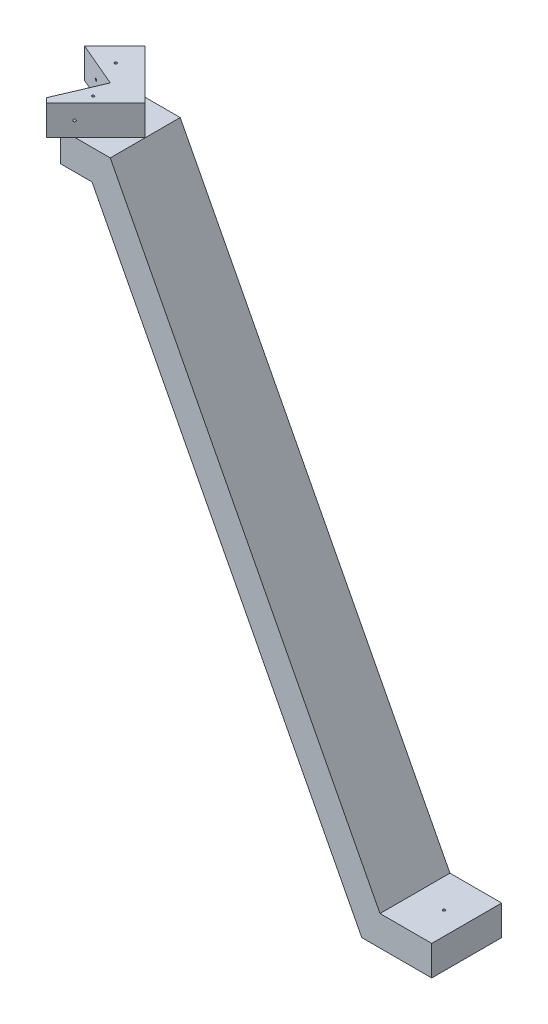
ISO-10303-21;
HEADER;
FILE_DESCRIPTION(('STEP AP214'),'2;1');
FILE_NAME('part.step','',(''),(''),'','','');
FILE_SCHEMA(('AUTOMOTIVE_DESIGN { 1 0 10303 214 1 1 1 1 }'));
ENDSEC;
DATA;
#1=APPLICATION_CONTEXT('core data for automotive mechanical design processes');
#2=APPLICATION_PROTOCOL_DEFINITION('international standard','automotive_design',2000,#1);
#3=PRODUCT_CONTEXT('',#1,'mechanical');
#4=PRODUCT('Part','Part','',(#3));
#5=PRODUCT_RELATED_PRODUCT_CATEGORY('part','',(#4));
#6=PRODUCT_DEFINITION_FORMATION('','',#4);
#7=PRODUCT_DEFINITION_CONTEXT('part definition',#1,'design');
#8=PRODUCT_DEFINITION('design','',#6,#7);
#9=PRODUCT_DEFINITION_SHAPE('','',#8);
#10=(LENGTH_UNIT() NAMED_UNIT(*) SI_UNIT(.MILLI.,.METRE.));
#11=(NAMED_UNIT(*) PLANE_ANGLE_UNIT() SI_UNIT($,.RADIAN.));
#12=(NAMED_UNIT(*) SI_UNIT($,.STERADIAN.) SOLID_ANGLE_UNIT());
#13=UNCERTAINTY_MEASURE_WITH_UNIT(LENGTH_MEASURE(1.E-05),#10,'distance_accuracy_value','');
#14=(GEOMETRIC_REPRESENTATION_CONTEXT(3) GLOBAL_UNCERTAINTY_ASSIGNED_CONTEXT((#13)) GLOBAL_UNIT_ASSIGNED_CONTEXT((#10,
#11,#12)) REPRESENTATION_CONTEXT('',''));
#15=CARTESIAN_POINT('',(0.,0.,0.));
#16=DIRECTION('',(0.,0.,1.));
#17=DIRECTION('',(1.,0.,0.));
#18=AXIS2_PLACEMENT_3D('',#15,#16,#17);
#19=CARTESIAN_POINT('',(-319.752925071649,698.5,44.45));
#20=DIRECTION('',(0.,-1.,0.));
#21=DIRECTION('',(0.,0.,-1.));
#22=AXIS2_PLACEMENT_3D('',#19,#20,#21);
#23=PLANE('',#22);
#24=DIRECTION('',(-0.707106781186549,0.,0.707106781186546));
#25=VECTOR('',#24,1.);
#26=CARTESIAN_POINT('',(-445.476510766618,698.5,0.));
#27=LINE('',#26,#25);
#28=CARTESIAN_POINT('',(-401.026510766617,698.5,-44.45));
#29=VERTEX_POINT('',#28);
#30=CARTESIAN_POINT('',(-408.652925071649,698.5,-36.8235856949683));
#31=VERTEX_POINT('',#30);
#32=EDGE_CURVE('E54',#29,#31,#27,.T.);
#33=ORIENTED_EDGE('',*,*,#32,.F.);
#34=DIRECTION('',(-1.,0.,0.));
#35=VECTOR('',#34,1.);
#36=CARTESIAN_POINT('',(-319.752925071649,698.5,-44.45));
#37=LINE('',#36,#35);
#38=CARTESIAN_POINT('',(-408.652925071649,698.5,-44.45));
#39=VERTEX_POINT('',#38);
#40=EDGE_CURVE('E286',#29,#39,#37,.T.);
#41=ORIENTED_EDGE('',*,*,#40,.T.);
#42=DIRECTION('',(0.,0.,-1.));
#43=VECTOR('',#42,1.);
#44=CARTESIAN_POINT('',(-408.652925071649,698.5,44.45));
#45=LINE('',#44,#43);
#46=EDGE_CURVE('E310',#31,#39,#45,.T.);
#47=ORIENTED_EDGE('',*,*,#46,.F.);
#48=EDGE_LOOP('',(#33,#41,#47));
#49=FACE_BOUND('',#48,.T.);
#50=ADVANCED_FACE('F39',(#49),#23,.F.);
#51=DIRECTION('',(-0.707106781186549,0.,-0.707106781186546));
#52=VECTOR('',#51,1.);
#53=CARTESIAN_POINT('',(-382.614717919133,698.5,-62.8617928474839));
#54=LINE('',#53,#52);
#55=CARTESIAN_POINT('',(-319.752925071649,698.5,0.));
#56=VERTEX_POINT('',#55);
#57=CARTESIAN_POINT('',(-364.202925071649,698.5,-44.45));
#58=VERTEX_POINT('',#57);
#59=EDGE_CURVE('E70',#56,#58,#54,.T.);
#60=ORIENTED_EDGE('',*,*,#59,.F.);
#61=DIRECTION('',(0.,0.,-1.));
#62=VECTOR('',#61,1.);
#63=CARTESIAN_POINT('',(-319.752925071649,698.5,44.45));
#64=LINE('',#63,#62);
#65=CARTESIAN_POINT('',(-319.752925071649,698.5,-44.45));
#66=VERTEX_POINT('',#65);
#67=EDGE_CURVE('E314',#56,#66,#64,.T.);
#68=ORIENTED_EDGE('',*,*,#67,.T.);
#69=EDGE_CURVE('E287',#66,#58,#37,.T.);
#70=ORIENTED_EDGE('',*,*,#69,.T.);
#71=EDGE_LOOP('',(#60,#68,#70));
#72=FACE_BOUND('',#71,.T.);
#73=ADVANCED_FACE('F433',(#72),#23,.F.);
#74=DIRECTION('',(0.707106781186549,0.,-0.707106781186546));
#75=VECTOR('',#74,1.);
#76=CARTESIAN_POINT('',(-319.752925071649,698.5,0.));
#77=LINE('',#76,#75);
#78=CARTESIAN_POINT('',(-364.202925071649,698.5,44.45));
#79=VERTEX_POINT('',#78);
#80=EDGE_CURVE('E225',#79,#56,#77,.T.);
#81=ORIENTED_EDGE('',*,*,#80,.F.);
#82=DIRECTION('',(-1.,0.,0.));
#83=VECTOR('',#82,1.);
#84=CARTESIAN_POINT('',(-319.752925071649,698.5,44.45));
#85=LINE('',#84,#83);
#86=CARTESIAN_POINT('',(-319.752925071649,698.5,44.45));
#87=VERTEX_POINT('',#86);
#88=EDGE_CURVE('E263',#87,#79,#85,.T.);
#89=ORIENTED_EDGE('',*,*,#88,.F.);
#90=EDGE_CURVE('E315',#87,#56,#64,.T.);
#91=ORIENTED_EDGE('',*,*,#90,.T.);
#92=EDGE_LOOP('',(#81,#89,#91));
#93=FACE_BOUND('',#92,.T.);
#94=ADVANCED_FACE('F452',(#93),#23,.F.);
#95=CARTESIAN_POINT('',(88.9,0.,44.45));
#96=DIRECTION('',(0.,1.,0.));
#97=DIRECTION('',(0.,0.,1.));
#98=AXIS2_PLACEMENT_3D('',#95,#96,#97);
#99=PLANE('',#98);
#100=CARTESIAN_POINT('',(60.1472,0.,0.));
#101=DIRECTION('',(0.,1.,0.));
#102=DIRECTION('',(0.,0.,1.));
#103=AXIS2_PLACEMENT_3D('',#100,#101,#102);
#104=CIRCLE('',#103,1.58749999999999);
#105=CARTESIAN_POINT('',(60.1472,0.,1.58749999999999));
#106=VERTEX_POINT('',#105);
#107=EDGE_CURVE('E243',#106,#106,#104,.T.);
#108=ORIENTED_EDGE('',*,*,#107,.T.);
#109=EDGE_LOOP('',(#108));
#110=FACE_BOUND('',#109,.T.);
#111=DIRECTION('',(1.,0.,0.));
#112=VECTOR('',#111,1.);
#113=CARTESIAN_POINT('',(88.9,0.,-44.45));
#114=LINE('',#113,#112);
#115=CARTESIAN_POINT('',(0.,0.,-44.45));
#116=VERTEX_POINT('',#115);
#117=CARTESIAN_POINT('',(88.9,0.,-44.45));
#118=VERTEX_POINT('',#117);
#119=EDGE_CURVE('E247',#116,#118,#114,.T.);
#120=ORIENTED_EDGE('',*,*,#119,.T.);
#121=DIRECTION('',(0.,0.,-1.));
#122=VECTOR('',#121,1.);
#123=CARTESIAN_POINT('',(88.9,0.,44.45));
#124=LINE('',#123,#122);
#125=CARTESIAN_POINT('',(88.9,0.,44.45));
#126=VERTEX_POINT('',#125);
#127=EDGE_CURVE('E327',#126,#118,#124,.T.);
#128=ORIENTED_EDGE('',*,*,#127,.F.);
#129=DIRECTION('',(1.,0.,0.));
#130=VECTOR('',#129,1.);
#131=CARTESIAN_POINT('',(88.9,0.,44.45));
#132=LINE('',#131,#130);
#133=CARTESIAN_POINT('',(0.,0.,44.45));
#134=VERTEX_POINT('',#133);
#135=EDGE_CURVE('E248',#134,#126,#132,.T.);
#136=ORIENTED_EDGE('',*,*,#135,.F.);
#137=DIRECTION('',(0.,0.,-1.));
#138=VECTOR('',#137,1.);
#139=CARTESIAN_POINT('',(0.,0.,44.45));
#140=LINE('',#139,#138);
#141=EDGE_CURVE('E272',#134,#116,#140,.T.);
#142=ORIENTED_EDGE('',*,*,#141,.T.);
#143=EDGE_LOOP('',(#120,#128,#136,#142));
#144=FACE_BOUND('',#143,.T.);
#145=ADVANCED_FACE('F41',(#110,#144),#99,.F.);
#146=CARTESIAN_POINT('',(88.9,38.1,44.45));
#147=DIRECTION('',(-1.,0.,0.));
#148=DIRECTION('',(0.,0.,1.));
#149=AXIS2_PLACEMENT_3D('',#146,#147,#148);
#150=PLANE('',#149);
#151=DIRECTION('',(0.,1.,0.));
#152=VECTOR('',#151,1.);
#153=CARTESIAN_POINT('',(88.9,38.1,-44.45));
#154=LINE('',#153,#152);
#155=CARTESIAN_POINT('',(88.9,38.1,-44.45));
#156=VERTEX_POINT('',#155);
#157=EDGE_CURVE('E276',#118,#156,#154,.T.);
#158=ORIENTED_EDGE('',*,*,#157,.T.);
#159=DIRECTION('',(0.,0.,-1.));
#160=VECTOR('',#159,1.);
#161=CARTESIAN_POINT('',(88.9,38.1,44.45));
#162=LINE('',#161,#160);
#163=CARTESIAN_POINT('',(88.9,38.1,44.45));
#164=VERTEX_POINT('',#163);
#165=EDGE_CURVE('E323',#164,#156,#162,.T.);
#166=ORIENTED_EDGE('',*,*,#165,.F.);
#167=DIRECTION('',(0.,1.,0.));
#168=VECTOR('',#167,1.);
#169=CARTESIAN_POINT('',(88.9,38.1,44.45));
#170=LINE('',#169,#168);
#171=EDGE_CURVE('E252',#126,#164,#170,.T.);
#172=ORIENTED_EDGE('',*,*,#171,.F.);
#173=ORIENTED_EDGE('',*,*,#127,.T.);
#174=EDGE_LOOP('',(#158,#166,#172,#173));
#175=FACE_BOUND('',#174,.T.);
#176=ADVANCED_FACE('F444',(#175),#150,.F.);
#177=CARTESIAN_POINT('',(23.1470749283508,38.1,44.45));
#178=DIRECTION('',(0.,-1.,0.));
#179=DIRECTION('',(0.,0.,-1.));
#180=AXIS2_PLACEMENT_3D('',#177,#178,#179);
#181=PLANE('',#180);
#182=CARTESIAN_POINT('',(60.1472,38.1,0.));
#183=DIRECTION('',(0.,1.,0.));
#184=DIRECTION('',(0.,0.,1.));
#185=AXIS2_PLACEMENT_3D('',#182,#183,#184);
#186=CIRCLE('',#185,1.58749999999999);
#187=CARTESIAN_POINT('',(60.1472,38.1,1.58749999999999));
#188=VERTEX_POINT('',#187);
#189=EDGE_CURVE('E239',#188,#188,#186,.T.);
#190=ORIENTED_EDGE('',*,*,#189,.F.);
#191=EDGE_LOOP('',(#190));
#192=FACE_BOUND('',#191,.T.);
#193=DIRECTION('',(-1.,0.,0.));
#194=VECTOR('',#193,1.);
#195=CARTESIAN_POINT('',(23.1470749283508,38.1,-44.45));
#196=LINE('',#195,#194);
#197=CARTESIAN_POINT('',(23.1470749283508,38.1,-44.45));
#198=VERTEX_POINT('',#197);
#199=EDGE_CURVE('E279',#156,#198,#196,.T.);
#200=ORIENTED_EDGE('',*,*,#199,.T.);
#201=DIRECTION('',(0.,0.,-1.));
#202=VECTOR('',#201,1.);
#203=CARTESIAN_POINT('',(23.1470749283508,38.1,44.45));
#204=LINE('',#203,#202);
#205=CARTESIAN_POINT('',(23.1470749283508,38.1,44.45));
#206=VERTEX_POINT('',#205);
#207=EDGE_CURVE('E319',#206,#198,#204,.T.);
#208=ORIENTED_EDGE('',*,*,#207,.F.);
#209=DIRECTION('',(-1.,0.,0.));
#210=VECTOR('',#209,1.);
#211=CARTESIAN_POINT('',(23.1470749283508,38.1,44.45));
#212=LINE('',#211,#210);
#213=EDGE_CURVE('E256',#164,#206,#212,.T.);
#214=ORIENTED_EDGE('',*,*,#213,.F.);
#215=ORIENTED_EDGE('',*,*,#165,.T.);
#216=EDGE_LOOP('',(#200,#208,#214,#215));
#217=FACE_BOUND('',#216,.T.);
#218=ADVANCED_FACE('F441',(#192,#217),#181,.F.);
#219=CARTESIAN_POINT('',(-319.752925071649,698.5,44.45));
#220=DIRECTION('',(-0.88749607680174,-0.460815270647057,0.));
#221=DIRECTION('',(0.460815270647057,-0.88749607680174,0.));
#222=AXIS2_PLACEMENT_3D('',#219,#220,#221);
#223=PLANE('',#222);
#224=DIRECTION('',(-0.460815270647057,0.88749607680174,0.));
#225=VECTOR('',#224,1.);
#226=CARTESIAN_POINT('',(-319.752925071649,698.5,-44.45));
#227=LINE('',#226,#225);
#228=EDGE_CURVE('E282',#198,#66,#227,.T.);
#229=ORIENTED_EDGE('',*,*,#228,.T.);
#230=ORIENTED_EDGE('',*,*,#67,.F.);
#231=ORIENTED_EDGE('',*,*,#90,.F.);
#232=DIRECTION('',(-0.460815270647057,0.88749607680174,0.));
#233=VECTOR('',#232,1.);
#234=CARTESIAN_POINT('',(-319.752925071649,698.5,44.45));
#235=LINE('',#234,#233);
#236=EDGE_CURVE('E259',#206,#87,#235,.T.);
#237=ORIENTED_EDGE('',*,*,#236,.F.);
#238=ORIENTED_EDGE('',*,*,#207,.T.);
#239=EDGE_LOOP('',(#229,#230,#231,#237,#238));
#240=FACE_BOUND('',#239,.T.);
#241=ADVANCED_FACE('F437',(#240),#223,.F.);
#242=CARTESIAN_POINT('',(-408.652925071649,698.5,44.45));
#243=DIRECTION('',(1.,0.,0.));
#244=DIRECTION('',(0.,0.,-1.));
#245=AXIS2_PLACEMENT_3D('',#242,#243,#244);
#246=PLANE('',#245);
#247=DIRECTION('',(0.,0.,-1.));
#248=VECTOR('',#247,1.);
#249=CARTESIAN_POINT('',(-408.652925071649,660.4,44.45));
#250=LINE('',#249,#248);
#251=CARTESIAN_POINT('',(-408.652925071649,660.4,-18.9769560653851));
#252=VERTEX_POINT('',#251);
#253=CARTESIAN_POINT('',(-408.652925071649,660.4,-44.45));
#254=VERTEX_POINT('',#253);
#255=EDGE_CURVE('E307',#252,#254,#250,.T.);
#256=ORIENTED_EDGE('',*,*,#255,.F.);
#257=DIRECTION('',(0.,1.,0.));
#258=VECTOR('',#257,1.);
#259=CARTESIAN_POINT('',(-408.652925071649,698.5,-18.9769560653851));
#260=LINE('',#259,#258);
#261=CARTESIAN_POINT('',(-408.652925071649,698.5,-18.9769560653851));
#262=VERTEX_POINT('',#261);
#263=EDGE_CURVE('E171',#252,#262,#260,.T.);
#264=ORIENTED_EDGE('',*,*,#263,.T.);
#265=EDGE_CURVE('E311',#262,#31,#45,.T.);
#266=ORIENTED_EDGE('',*,*,#265,.T.);
#267=ORIENTED_EDGE('',*,*,#46,.T.);
#268=DIRECTION('',(0.,-1.,0.));
#269=VECTOR('',#268,1.);
#270=CARTESIAN_POINT('',(-408.652925071649,698.5,-44.45));
#271=LINE('',#270,#269);
#272=EDGE_CURVE('E290',#39,#254,#271,.T.);
#273=ORIENTED_EDGE('',*,*,#272,.T.);
#274=EDGE_LOOP('',(#256,#264,#266,#267,#273));
#275=FACE_BOUND('',#274,.T.);
#276=ADVANCED_FACE('F398',(#275),#246,.F.);
#277=CARTESIAN_POINT('',(-408.652925071649,660.4,44.45));
#278=DIRECTION('',(0.,1.,0.));
#279=DIRECTION('',(0.,0.,1.));
#280=AXIS2_PLACEMENT_3D('',#277,#278,#279);
#281=PLANE('',#280);
#282=CARTESIAN_POINT('',(-360.68,660.4,25.4));
#283=DIRECTION('',(0.,-1.,0.));
#284=DIRECTION('',(0.,0.,-1.));
#285=AXIS2_PLACEMENT_3D('',#282,#283,#284);
#286=CIRCLE('',#285,1.58749999999996);
#287=CARTESIAN_POINT('',(-360.68,660.4,23.8125));
#288=VERTEX_POINT('',#287);
#289=EDGE_CURVE('E680',#288,#288,#286,.T.);
#290=ORIENTED_EDGE('',*,*,#289,.F.);
#291=EDGE_LOOP('',(#290));
#292=FACE_BOUND('',#291,.T.);
#293=CARTESIAN_POINT('',(-382.614717919133,660.4,-25.4));
#294=DIRECTION('',(0.,-1.,0.));
#295=DIRECTION('',(0.,0.,-1.));
#296=AXIS2_PLACEMENT_3D('',#293,#294,#295);
#297=CIRCLE('',#296,1.58749999999996);
#298=CARTESIAN_POINT('',(-382.614717919133,660.4,-26.9875));
#299=VERTEX_POINT('',#298);
#300=EDGE_CURVE('E683',#299,#299,#297,.T.);
#301=ORIENTED_EDGE('',*,*,#300,.F.);
#302=EDGE_LOOP('',(#301));
#303=FACE_BOUND('',#302,.T.);
#304=DIRECTION('',(1.,0.,0.));
#305=VECTOR('',#304,1.);
#306=CARTESIAN_POINT('',(-408.652925071649,660.4,44.45));
#307=LINE('',#306,#305);
#308=CARTESIAN_POINT('',(-383.179881137034,660.4,44.45));
#309=VERTEX_POINT('',#308);
#310=CARTESIAN_POINT('',(-342.9,660.4,44.45));
#311=VERTEX_POINT('',#310);
#312=EDGE_CURVE('E187',#309,#311,#307,.T.);
#313=ORIENTED_EDGE('',*,*,#312,.F.);
#314=DIRECTION('',(0.392642119385449,0.,-0.919691342834379));
#315=VECTOR('',#314,1.);
#316=CARTESIAN_POINT('',(-387.107005143668,660.4,53.6485596369314));
#317=LINE('',#316,#315);
#318=CARTESIAN_POINT('',(-364.202925071649,660.4,0.));
#319=VERTEX_POINT('',#318);
#320=EDGE_CURVE('E179',#309,#319,#317,.T.);
#321=ORIENTED_EDGE('',*,*,#320,.T.);
#322=DIRECTION('',(-0.919691342834381,0.,-0.392642119385445));
#323=VECTOR('',#322,1.);
#324=CARTESIAN_POINT('',(-385.74884499963,660.4,-9.19855963693145));
#325=LINE('',#324,#323);
#326=EDGE_CURVE('E167',#319,#252,#325,.T.);
#327=ORIENTED_EDGE('',*,*,#326,.T.);
#328=ORIENTED_EDGE('',*,*,#255,.T.);
#329=DIRECTION('',(1.,0.,0.));
#330=VECTOR('',#329,1.);
#331=CARTESIAN_POINT('',(-408.652925071649,660.4,-44.45));
#332=LINE('',#331,#330);
#333=CARTESIAN_POINT('',(-342.9,660.4,-44.45));
#334=VERTEX_POINT('',#333);
#335=EDGE_CURVE('E295',#254,#334,#332,.T.);
#336=ORIENTED_EDGE('',*,*,#335,.T.);
#337=DIRECTION('',(0.,0.,-1.));
#338=VECTOR('',#337,1.);
#339=CARTESIAN_POINT('',(-342.9,660.4,44.45));
#340=LINE('',#339,#338);
#341=EDGE_CURVE('E303',#311,#334,#340,.T.);
#342=ORIENTED_EDGE('',*,*,#341,.F.);
#343=EDGE_LOOP('',(#313,#321,#327,#328,#336,#342));
#344=FACE_BOUND('',#343,.T.);
#345=ADVANCED_FACE('F185',(#292,#303,#344),#281,.F.);
#346=CARTESIAN_POINT('',(0.,0.,44.45));
#347=DIRECTION('',(0.88749607680174,0.460815270647057,0.));
#348=DIRECTION('',(-0.460815270647057,0.88749607680174,0.));
#349=AXIS2_PLACEMENT_3D('',#346,#347,#348);
#350=PLANE('',#349);
#351=DIRECTION('',(0.460815270647057,-0.88749607680174,0.));
#352=VECTOR('',#351,1.);
#353=CARTESIAN_POINT('',(0.,0.,-44.45));
#354=LINE('',#353,#352);
#355=EDGE_CURVE('E253',#334,#116,#354,.T.);
#356=ORIENTED_EDGE('',*,*,#355,.T.);
#357=ORIENTED_EDGE('',*,*,#141,.F.);
#358=DIRECTION('',(0.460815270647057,-0.88749607680174,0.));
#359=VECTOR('',#358,1.);
#360=CARTESIAN_POINT('',(0.,0.,44.45));
#361=LINE('',#360,#359);
#362=EDGE_CURVE('E269',#311,#134,#361,.T.);
#363=ORIENTED_EDGE('',*,*,#362,.F.);
#364=ORIENTED_EDGE('',*,*,#341,.T.);
#365=EDGE_LOOP('',(#356,#357,#363,#364));
#366=FACE_BOUND('',#365,.T.);
#367=ADVANCED_FACE('F406',(#366),#350,.F.);
#368=CARTESIAN_POINT('',(0.,0.,44.45));
#369=DIRECTION('',(0.,0.,1.));
#370=DIRECTION('',(1.,0.,0.));
#371=AXIS2_PLACEMENT_3D('',#368,#369,#370);
#372=PLANE('',#371);
#373=DIRECTION('',(0.,1.,0.));
#374=VECTOR('',#373,1.);
#375=CARTESIAN_POINT('',(-383.179881137034,0.,44.45));
#376=LINE('',#375,#374);
#377=CARTESIAN_POINT('',(-383.179881137034,698.5,44.45));
#378=VERTEX_POINT('',#377);
#379=EDGE_CURVE('E190',#309,#378,#376,.T.);
#380=ORIENTED_EDGE('',*,*,#379,.F.);
#381=ORIENTED_EDGE('',*,*,#312,.T.);
#382=ORIENTED_EDGE('',*,*,#362,.T.);
#383=ORIENTED_EDGE('',*,*,#135,.T.);
#384=ORIENTED_EDGE('',*,*,#171,.T.);
#385=ORIENTED_EDGE('',*,*,#213,.T.);
#386=ORIENTED_EDGE('',*,*,#236,.T.);
#387=ORIENTED_EDGE('',*,*,#88,.T.);
#388=EDGE_CURVE('E262',#79,#378,#85,.T.);
#389=ORIENTED_EDGE('',*,*,#388,.T.);
#390=EDGE_LOOP('',(#380,#381,#382,#383,#384,#385,#386,#387,#389));
#391=FACE_BOUND('',#390,.T.);
#392=ADVANCED_FACE('F415',(#391),#372,.T.);
#393=CARTESIAN_POINT('',(0.,0.,-44.45));
#394=DIRECTION('',(0.,0.,1.));
#395=DIRECTION('',(1.,0.,0.));
#396=AXIS2_PLACEMENT_3D('',#393,#394,#395);
#397=PLANE('',#396);
#398=ORIENTED_EDGE('',*,*,#119,.F.);
#399=ORIENTED_EDGE('',*,*,#355,.F.);
#400=ORIENTED_EDGE('',*,*,#335,.F.);
#401=ORIENTED_EDGE('',*,*,#272,.F.);
#402=ORIENTED_EDGE('',*,*,#40,.F.);
#403=EDGE_CURVE('E291',#58,#29,#37,.T.);
#404=ORIENTED_EDGE('',*,*,#403,.F.);
#405=ORIENTED_EDGE('',*,*,#69,.F.);
#406=ORIENTED_EDGE('',*,*,#228,.F.);
#407=ORIENTED_EDGE('',*,*,#199,.F.);
#408=ORIENTED_EDGE('',*,*,#157,.F.);
#409=EDGE_LOOP('',(#398,#399,#400,#401,#402,#404,#405,#406,#407,#408));
#410=FACE_BOUND('',#409,.T.);
#411=ADVANCED_FACE('F409',(#410),#397,.F.);
#412=CARTESIAN_POINT('',(60.1472,38.1,0.));
#413=DIRECTION('',(0.,1.,0.));
#414=DIRECTION('',(0.,0.,1.));
#415=AXIS2_PLACEMENT_3D('',#412,#413,#414);
#416=CYLINDRICAL_SURFACE('',#415,1.58749999999999);
#417=ORIENTED_EDGE('',*,*,#107,.F.);
#418=EDGE_LOOP('',(#417));
#419=FACE_BOUND('',#418,.T.);
#420=ORIENTED_EDGE('',*,*,#189,.T.);
#421=EDGE_LOOP('',(#420));
#422=FACE_BOUND('',#421,.T.);
#423=ADVANCED_FACE('F494',(#419,#422),#416,.F.);
#424=CARTESIAN_POINT('',(0.,698.5,0.));
#425=DIRECTION('',(0.,-1.,0.));
#426=DIRECTION('',(0.,0.,-1.));
#427=AXIS2_PLACEMENT_3D('',#424,#425,#426);
#428=PLANE('',#427);
#429=DIRECTION('',(0.919691342834381,0.,0.392642119385445));
#430=VECTOR('',#429,1.);
#431=CARTESIAN_POINT('',(-56.1483760639832,698.5,131.517157306198));
#432=LINE('',#431,#430);
#433=CARTESIAN_POINT('',(-421.159952623424,698.5,-24.3165581431936));
#434=VERTEX_POINT('',#433);
#435=EDGE_CURVE('E360',#434,#262,#432,.T.);
#436=ORIENTED_EDGE('',*,*,#435,.F.);
#437=EDGE_CURVE('E189',#31,#434,#27,.T.);
#438=ORIENTED_EDGE('',*,*,#437,.F.);
#439=ORIENTED_EDGE('',*,*,#265,.F.);
#440=EDGE_LOOP('',(#436,#438,#439));
#441=FACE_BOUND('',#440,.T.);
#442=ADVANCED_FACE('F396',(#441),#428,.T.);
#443=DIRECTION('',(-0.392642119385449,0.,0.919691342834379));
#444=VECTOR('',#443,1.);
#445=CARTESIAN_POINT('',(-308.054549007665,698.5,-131.517157306199));
#446=LINE('',#445,#444);
#447=CARTESIAN_POINT('',(-388.519483214843,698.5,56.9570275517744));
#448=VERTEX_POINT('',#447);
#449=EDGE_CURVE('E197',#378,#448,#446,.T.);
#450=ORIENTED_EDGE('',*,*,#449,.F.);
#451=ORIENTED_EDGE('',*,*,#388,.F.);
#452=CARTESIAN_POINT('',(-382.614717919133,698.5,62.8617928474839));
#453=VERTEX_POINT('',#452);
#454=EDGE_CURVE('E220',#453,#79,#77,.T.);
#455=ORIENTED_EDGE('',*,*,#454,.F.);
#456=DIRECTION('',(0.707106781186549,0.,0.707106781186546));
#457=VECTOR('',#456,1.);
#458=CARTESIAN_POINT('',(-382.614717919133,698.5,62.8617928474839));
#459=LINE('',#458,#457);
#460=EDGE_CURVE('E217',#448,#453,#459,.T.);
#461=ORIENTED_EDGE('',*,*,#460,.F.);
#462=EDGE_LOOP('',(#450,#451,#455,#461));
#463=FACE_BOUND('',#462,.T.);
#464=ADVANCED_FACE('F378',(#463),#428,.T.);
#465=CARTESIAN_POINT('',(-445.476510766618,736.6,0.));
#466=DIRECTION('',(0.707106781186546,0.,0.707106781186549));
#467=DIRECTION('',(0.707106781186549,0.,-0.707106781186546));
#468=AXIS2_PLACEMENT_3D('',#465,#466,#467);
#469=PLANE('',#468);
#470=ORIENTED_EDGE('',*,*,#437,.T.);
#471=DIRECTION('',(0.,1.,0.));
#472=VECTOR('',#471,1.);
#473=CARTESIAN_POINT('',(-421.159952623424,736.6,-24.3165581431936));
#474=LINE('',#473,#472);
#475=CARTESIAN_POINT('',(-421.159952623424,736.6,-24.3165581431936));
#476=VERTEX_POINT('',#475);
#477=EDGE_CURVE('E182',#434,#476,#474,.T.);
#478=ORIENTED_EDGE('',*,*,#477,.T.);
#479=DIRECTION('',(-0.707106781186549,0.,0.707106781186546));
#480=VECTOR('',#479,1.);
#481=CARTESIAN_POINT('',(-445.476510766618,736.6,0.));
#482=LINE('',#481,#480);
#483=CARTESIAN_POINT('',(-382.614717919133,736.6,-62.8617928474839));
#484=VERTEX_POINT('',#483);
#485=EDGE_CURVE('E201',#484,#476,#482,.T.);
#486=ORIENTED_EDGE('',*,*,#485,.F.);
#487=DIRECTION('',(0.,-1.,0.));
#488=VECTOR('',#487,1.);
#489=CARTESIAN_POINT('',(-382.614717919133,736.6,-62.8617928474839));
#490=LINE('',#489,#488);
#491=CARTESIAN_POINT('',(-382.614717919133,698.5,-62.8617928474839));
#492=VERTEX_POINT('',#491);
#493=EDGE_CURVE('E213',#484,#492,#490,.T.);
#494=ORIENTED_EDGE('',*,*,#493,.T.);
#495=EDGE_CURVE('E195',#492,#29,#27,.T.);
#496=ORIENTED_EDGE('',*,*,#495,.T.);
#497=ORIENTED_EDGE('',*,*,#32,.T.);
#498=EDGE_LOOP('',(#470,#478,#486,#494,#496,#497));
#499=FACE_BOUND('',#498,.T.);
#500=ADVANCED_FACE('F391',(#499),#469,.F.);
#501=CARTESIAN_POINT('',(-382.614717919133,736.6,62.8617928474839));
#502=DIRECTION('',(0.707106781186546,0.,-0.707106781186549));
#503=DIRECTION('',(-0.707106781186549,0.,-0.707106781186546));
#504=AXIS2_PLACEMENT_3D('',#501,#502,#503);
#505=PLANE('',#504);
#506=DIRECTION('',(0.707106781186549,0.,0.707106781186546));
#507=VECTOR('',#506,1.);
#508=CARTESIAN_POINT('',(-382.614717919133,736.6,62.8617928474839));
#509=LINE('',#508,#507);
#510=CARTESIAN_POINT('',(-388.519483214843,736.6,56.9570275517745));
#511=VERTEX_POINT('',#510);
#512=CARTESIAN_POINT('',(-382.614717919133,736.6,62.8617928474839));
#513=VERTEX_POINT('',#512);
#514=EDGE_CURVE('E205',#511,#513,#509,.T.);
#515=ORIENTED_EDGE('',*,*,#514,.F.);
#516=DIRECTION('',(0.,-1.,0.));
#517=VECTOR('',#516,1.);
#518=CARTESIAN_POINT('',(-388.519483214843,736.6,56.9570275517744));
#519=LINE('',#518,#517);
#520=EDGE_CURVE('E176',#511,#448,#519,.T.);
#521=ORIENTED_EDGE('',*,*,#520,.T.);
#522=ORIENTED_EDGE('',*,*,#460,.T.);
#523=DIRECTION('',(0.,-1.,0.));
#524=VECTOR('',#523,1.);
#525=CARTESIAN_POINT('',(-382.614717919133,736.6,62.8617928474839));
#526=LINE('',#525,#524);
#527=EDGE_CURVE('E235',#513,#453,#526,.T.);
#528=ORIENTED_EDGE('',*,*,#527,.F.);
#529=EDGE_LOOP('',(#515,#521,#522,#528));
#530=FACE_BOUND('',#529,.T.);
#531=ADVANCED_FACE('F375',(#530),#505,.F.);
#532=CARTESIAN_POINT('',(-319.752925071649,736.6,0.));
#533=DIRECTION('',(-0.707106781186546,0.,-0.707106781186549));
#534=DIRECTION('',(-0.707106781186549,0.,0.707106781186546));
#535=AXIS2_PLACEMENT_3D('',#532,#533,#534);
#536=PLANE('',#535);
#537=CARTESIAN_POINT('',(-364.654205676995,717.55,44.9012806053456));
#538=DIRECTION('',(0.707106781186546,0.,0.707106781186549));
#539=DIRECTION('',(0.707106781186549,0.,-0.707106781186546));
#540=AXIS2_PLACEMENT_3D('',#537,#538,#539);
#541=CIRCLE('',#540,1.58749999999996);
#542=CARTESIAN_POINT('',(-363.531673661861,717.55,43.778748590212));
#543=VERTEX_POINT('',#542);
#544=EDGE_CURVE('E334',#543,#543,#541,.T.);
#545=ORIENTED_EDGE('',*,*,#544,.F.);
#546=EDGE_LOOP('',(#545));
#547=FACE_BOUND('',#546,.T.);
#548=ORIENTED_EDGE('',*,*,#454,.T.);
#549=ORIENTED_EDGE('',*,*,#80,.T.);
#550=DIRECTION('',(0.,-1.,0.));
#551=VECTOR('',#550,1.);
#552=CARTESIAN_POINT('',(-319.752925071649,736.6,0.));
#553=LINE('',#552,#551);
#554=CARTESIAN_POINT('',(-319.752925071649,736.6,0.));
#555=VERTEX_POINT('',#554);
#556=EDGE_CURVE('E231',#555,#56,#553,.T.);
#557=ORIENTED_EDGE('',*,*,#556,.F.);
#558=DIRECTION('',(0.707106781186549,0.,-0.707106781186546));
#559=VECTOR('',#558,1.);
#560=CARTESIAN_POINT('',(-319.752925071649,736.6,0.));
#561=LINE('',#560,#559);
#562=EDGE_CURVE('E208',#513,#555,#561,.T.);
#563=ORIENTED_EDGE('',*,*,#562,.F.);
#564=ORIENTED_EDGE('',*,*,#527,.T.);
#565=EDGE_LOOP('',(#548,#549,#557,#563,#564));
#566=FACE_BOUND('',#565,.T.);
#567=ADVANCED_FACE('F381',(#547,#566),#536,.F.);
#568=CARTESIAN_POINT('',(-382.614717919133,736.6,-62.8617928474839));
#569=DIRECTION('',(-0.707106781186546,0.,0.707106781186549));
#570=DIRECTION('',(0.707106781186549,0.,0.707106781186546));
#571=AXIS2_PLACEMENT_3D('',#568,#569,#570);
#572=PLANE('',#571);
#573=CARTESIAN_POINT('',(-364.654205676995,717.55,-44.9012806053456));
#574=DIRECTION('',(0.707106781186546,0.,-0.707106781186549));
#575=DIRECTION('',(-0.707106781186549,0.,-0.707106781186546));
#576=AXIS2_PLACEMENT_3D('',#573,#574,#575);
#577=CIRCLE('',#576,1.58749999999996);
#578=CARTESIAN_POINT('',(-365.776737692129,717.55,-46.0238126204792));
#579=VERTEX_POINT('',#578);
#580=EDGE_CURVE('E338',#579,#579,#577,.T.);
#581=ORIENTED_EDGE('',*,*,#580,.F.);
#582=EDGE_LOOP('',(#581));
#583=FACE_BOUND('',#582,.T.);
#584=ORIENTED_EDGE('',*,*,#59,.T.);
#585=EDGE_CURVE('E224',#58,#492,#54,.T.);
#586=ORIENTED_EDGE('',*,*,#585,.T.);
#587=ORIENTED_EDGE('',*,*,#493,.F.);
#588=DIRECTION('',(-0.707106781186549,0.,-0.707106781186546));
#589=VECTOR('',#588,1.);
#590=CARTESIAN_POINT('',(-382.614717919133,736.6,-62.8617928474839));
#591=LINE('',#590,#589);
#592=EDGE_CURVE('E211',#555,#484,#591,.T.);
#593=ORIENTED_EDGE('',*,*,#592,.F.);
#594=ORIENTED_EDGE('',*,*,#556,.T.);
#595=EDGE_LOOP('',(#584,#586,#587,#593,#594));
#596=FACE_BOUND('',#595,.T.);
#597=ADVANCED_FACE('F426',(#583,#596),#572,.F.);
#598=CARTESIAN_POINT('',(0.,736.6,0.));
#599=DIRECTION('',(0.,-1.,0.));
#600=DIRECTION('',(0.,0.,-1.));
#601=AXIS2_PLACEMENT_3D('',#598,#599,#600);
#602=PLANE('',#601);
#603=CARTESIAN_POINT('',(-360.68,736.6,25.4));
#604=DIRECTION('',(0.,-1.,0.));
#605=DIRECTION('',(0.,0.,-1.));
#606=AXIS2_PLACEMENT_3D('',#603,#604,#605);
#607=CIRCLE('',#606,1.58749999999996);
#608=CARTESIAN_POINT('',(-360.68,736.6,23.8125));
#609=VERTEX_POINT('',#608);
#610=EDGE_CURVE('E685',#609,#609,#607,.T.);
#611=ORIENTED_EDGE('',*,*,#610,.T.);
#612=EDGE_LOOP('',(#611));
#613=FACE_BOUND('',#612,.T.);
#614=CARTESIAN_POINT('',(-382.614717919133,736.6,-25.4));
#615=DIRECTION('',(0.,-1.,0.));
#616=DIRECTION('',(0.,0.,-1.));
#617=AXIS2_PLACEMENT_3D('',#614,#615,#616);
#618=CIRCLE('',#617,1.58749999999996);
#619=CARTESIAN_POINT('',(-382.614717919133,736.6,-26.9875));
#620=VERTEX_POINT('',#619);
#621=EDGE_CURVE('E351',#620,#620,#618,.T.);
#622=ORIENTED_EDGE('',*,*,#621,.T.);
#623=EDGE_LOOP('',(#622));
#624=FACE_BOUND('',#623,.T.);
#625=DIRECTION('',(0.919691342834381,0.,0.392642119385445));
#626=VECTOR('',#625,1.);
#627=CARTESIAN_POINT('',(-56.1483760639832,736.6,131.517157306198));
#628=LINE('',#627,#626);
#629=CARTESIAN_POINT('',(-364.202925071649,736.6,0.));
#630=VERTEX_POINT('',#629);
#631=EDGE_CURVE('E11',#476,#630,#628,.T.);
#632=ORIENTED_EDGE('',*,*,#631,.T.);
#633=DIRECTION('',(-0.392642119385449,0.,0.919691342834379));
#634=VECTOR('',#633,1.);
#635=CARTESIAN_POINT('',(-445.476510766618,736.6,190.368300990636));
#636=LINE('',#635,#634);
#637=EDGE_CURVE('E62',#630,#511,#636,.T.);
#638=ORIENTED_EDGE('',*,*,#637,.T.);
#639=ORIENTED_EDGE('',*,*,#514,.T.);
#640=ORIENTED_EDGE('',*,*,#562,.T.);
#641=ORIENTED_EDGE('',*,*,#592,.T.);
#642=ORIENTED_EDGE('',*,*,#485,.T.);
#643=EDGE_LOOP('',(#632,#638,#639,#640,#641,#642));
#644=FACE_BOUND('',#643,.T.);
#645=ADVANCED_FACE('F386',(#613,#624,#644),#602,.F.);
#646=ORIENTED_EDGE('',*,*,#585,.F.);
#647=ORIENTED_EDGE('',*,*,#403,.T.);
#648=ORIENTED_EDGE('',*,*,#495,.F.);
#649=EDGE_LOOP('',(#646,#647,#648));
#650=FACE_BOUND('',#649,.T.);
#651=ADVANCED_FACE('F429',(#650),#428,.T.);
#652=CARTESIAN_POINT('',(-445.476510766618,736.6,190.368300990636));
#653=DIRECTION('',(0.919691342834379,0.,0.392642119385449));
#654=DIRECTION('',(0.392642119385449,0.,-0.919691342834379));
#655=AXIS2_PLACEMENT_3D('',#652,#653,#654);
#656=PLANE('',#655);
#657=CARTESIAN_POINT('',(-377.772133101446,717.55,31.7833531808947));
#658=DIRECTION('',(0.919691342834379,0.,0.392642119385449));
#659=DIRECTION('',(-0.392642119385449,0.,0.919691342834379));
#660=AXIS2_PLACEMENT_3D('',#657,#658,#659);
#661=ELLIPSE('',#660,1.71074204453317,1.58749999999996);
#662=CARTESIAN_POINT('',(-378.443842483533,717.55,33.3567078290747));
#663=VERTEX_POINT('',#662);
#664=EDGE_CURVE('E331',#663,#663,#661,.T.);
#665=ORIENTED_EDGE('',*,*,#664,.T.);
#666=EDGE_LOOP('',(#665));
#667=FACE_BOUND('',#666,.T.);
#668=ORIENTED_EDGE('',*,*,#379,.T.);
#669=ORIENTED_EDGE('',*,*,#449,.T.);
#670=ORIENTED_EDGE('',*,*,#520,.F.);
#671=ORIENTED_EDGE('',*,*,#637,.F.);
#672=DIRECTION('',(0.,-1.,0.));
#673=VECTOR('',#672,1.);
#674=CARTESIAN_POINT('',(-364.202925071649,736.6,0.));
#675=LINE('',#674,#673);
#676=EDGE_CURVE('E169',#630,#319,#675,.T.);
#677=ORIENTED_EDGE('',*,*,#676,.T.);
#678=ORIENTED_EDGE('',*,*,#320,.F.);
#679=EDGE_LOOP('',(#668,#669,#670,#671,#677,#678));
#680=FACE_BOUND('',#679,.T.);
#681=ADVANCED_FACE('F178',(#667,#680),#656,.F.);
#682=CARTESIAN_POINT('',(-364.202925071649,736.6,0.));
#683=DIRECTION('',(0.392642119385445,0.,-0.91969134283438));
#684=DIRECTION('',(-0.919691342834381,0.,-0.392642119385445));
#685=AXIS2_PLACEMENT_3D('',#682,#683,#684);
#686=PLANE('',#685);
#687=CARTESIAN_POINT('',(-395.986278252544,717.55,-13.5692080297966));
#688=DIRECTION('',(0.392642119385445,0.,-0.91969134283438));
#689=DIRECTION('',(0.91969134283438,0.,0.392642119385445));
#690=AXIS2_PLACEMENT_3D('',#687,#688,#689);
#691=ELLIPSE('',#690,1.71074204453317,1.58749999999996);
#692=CARTESIAN_POINT('',(-394.412923604364,717.55,-12.8974986477093));
#693=VERTEX_POINT('',#692);
#694=EDGE_CURVE('E335',#693,#693,#691,.T.);
#695=ORIENTED_EDGE('',*,*,#694,.T.);
#696=EDGE_LOOP('',(#695));
#697=FACE_BOUND('',#696,.T.);
#698=ORIENTED_EDGE('',*,*,#676,.F.);
#699=ORIENTED_EDGE('',*,*,#631,.F.);
#700=ORIENTED_EDGE('',*,*,#477,.F.);
#701=ORIENTED_EDGE('',*,*,#435,.T.);
#702=ORIENTED_EDGE('',*,*,#263,.F.);
#703=ORIENTED_EDGE('',*,*,#326,.F.);
#704=EDGE_LOOP('',(#698,#699,#700,#701,#702,#703));
#705=FACE_BOUND('',#704,.T.);
#706=ADVANCED_FACE('F168',(#697,#705),#686,.F.);
#707=CARTESIAN_POINT('',(-364.654205676995,717.55,44.9012806053456));
#708=DIRECTION('',(0.707106781186546,0.,0.707106781186549));
#709=DIRECTION('',(0.707106781186549,0.,-0.707106781186546));
#710=AXIS2_PLACEMENT_3D('',#707,#708,#709);
#711=CYLINDRICAL_SURFACE('',#710,1.58749999999996);
#712=ORIENTED_EDGE('',*,*,#544,.T.);
#713=EDGE_LOOP('',(#712));
#714=FACE_BOUND('',#713,.T.);
#715=ORIENTED_EDGE('',*,*,#664,.F.);
#716=EDGE_LOOP('',(#715));
#717=FACE_BOUND('',#716,.T.);
#718=ADVANCED_FACE('F592',(#714,#717),#711,.F.);
#719=CARTESIAN_POINT('',(-364.654205676995,717.55,-44.9012806053456));
#720=DIRECTION('',(0.707106781186546,0.,-0.707106781186549));
#721=DIRECTION('',(-0.707106781186549,0.,-0.707106781186546));
#722=AXIS2_PLACEMENT_3D('',#719,#720,#721);
#723=CYLINDRICAL_SURFACE('',#722,1.58749999999996);
#724=CARTESIAN_POINT('',(-382.614717919133,719.137156050003,-26.9875));
#725=CARTESIAN_POINT('',(-382.703013830066,719.135854038784,-26.9874913919654));
#726=CARTESIAN_POINT('',(-382.791355848711,719.130973706518,-26.9800937957219));
#727=CARTESIAN_POINT('',(-382.965520863115,719.117721762543,-26.9507896948888));
#728=CARTESIAN_POINT('',(-383.051333762804,719.109337774138,-26.9288315922184));
#729=CARTESIAN_POINT('',(-383.21792982597,719.092526608144,-26.8710656317189));
#730=CARTESIAN_POINT('',(-383.298725369402,719.084099597309,-26.8352935746224));
#731=CARTESIAN_POINT('',(-383.453360961147,719.070019032571,-26.7507718412671));
#732=CARTESIAN_POINT('',(-383.527210757407,719.064361543427,-26.7020407315958));
#733=CARTESIAN_POINT('',(-383.666065996317,719.057630720748,-26.5927446032393));
#734=CARTESIAN_POINT('',(-383.731054173836,719.056566215566,-26.532157028122));
#735=CARTESIAN_POINT('',(-383.849983279719,719.059396569839,-26.4010553016409));
#736=CARTESIAN_POINT('',(-383.903922058143,719.063292393389,-26.3305392229314));
#737=CARTESIAN_POINT('',(-383.997425746166,719.07455407444,-26.1845472743742));
#738=CARTESIAN_POINT('',(-384.037451368296,719.081785220506,-26.1093541298012));
#739=CARTESIAN_POINT('',(-384.104983419313,719.097459413895,-25.9536035607078));
#740=CARTESIAN_POINT('',(-384.132479934484,719.10590341397,-25.8730419459294));
#741=CARTESIAN_POINT('',(-384.175365231662,719.121561329526,-25.7041582454121));
#742=CARTESIAN_POINT('',(-384.190059428648,719.12868976574,-25.6156500982238));
#743=CARTESIAN_POINT('',(-384.204294758445,719.137397719629,-25.4371678788843));
#744=CARTESIAN_POINT('',(-384.203857766054,719.13898524401,-25.3471961108618));
#745=CARTESIAN_POINT('',(-384.189596102458,719.133438608292,-25.1882543095107));
#746=CARTESIAN_POINT('',(-384.178693087356,719.128119903883,-25.1189582083268));
#747=CARTESIAN_POINT('',(-384.148133064621,719.110058137712,-24.9833324918767));
#748=CARTESIAN_POINT('',(-384.128484005568,719.097321813998,-24.9170002430987));
#749=CARTESIAN_POINT('',(-384.081577733427,719.063218282819,-24.7891559408951));
#750=CARTESIAN_POINT('',(-384.054295899443,719.041823043018,-24.7276603253161));
#751=CARTESIAN_POINT('',(-383.994146129932,718.990028653156,-24.6115764851441));
#752=CARTESIAN_POINT('',(-383.961277154586,718.959627826286,-24.556989549626));
#753=CARTESIAN_POINT('',(-383.89411357138,718.891972613889,-24.4583552894064));
#754=CARTESIAN_POINT('',(-383.859967872434,718.85512732972,-24.4139224368459));
#755=CARTESIAN_POINT('',(-383.790979012575,718.774493815652,-24.3325661180318));
#756=CARTESIAN_POINT('',(-383.756135651563,718.730703568191,-24.295644841083));
#757=CARTESIAN_POINT('',(-383.684221808264,718.632386660079,-24.2256549983085));
#758=CARTESIAN_POINT('',(-383.647281744491,718.577222357216,-24.1933520036683));
#759=CARTESIAN_POINT('',(-383.577089885123,718.460805363901,-24.136656864009));
#760=CARTESIAN_POINT('',(-383.543840950627,718.39954801933,-24.1122708278631));
#761=CARTESIAN_POINT('',(-383.478035327813,718.261764272051,-24.0670767306825));
#762=CARTESIAN_POINT('',(-383.446455417584,718.184368767812,-24.0474803238079));
#763=CARTESIAN_POINT('',(-383.393449765393,718.024641649414,-24.0162789173667));
#764=CARTESIAN_POINT('',(-383.372024464344,717.942309821097,-24.0046742647919));
#765=CARTESIAN_POINT('',(-383.340619038267,717.770896131195,-23.9880634336096));
#766=CARTESIAN_POINT('',(-383.331202234611,717.681677492844,-23.9833804872697));
#767=CARTESIAN_POINT('',(-383.326727191114,717.502811217077,-23.9811246582999));
#768=CARTESIAN_POINT('',(-383.331664855986,717.413163709302,-23.9835497477701));
#769=CARTESIAN_POINT('',(-383.354741099483,717.240461914546,-23.9954815326575));
#770=CARTESIAN_POINT('',(-383.372241661968,717.157296693163,-24.0046464699768));
#771=CARTESIAN_POINT('',(-383.41805529687,716.995177541689,-24.030514013234));
#772=CARTESIAN_POINT('',(-383.446376867994,716.916226977436,-24.0472225457113));
#773=CARTESIAN_POINT('',(-383.512751198124,716.761365949417,-24.0902989117624));
#774=CARTESIAN_POINT('',(-383.551146129662,716.685701210607,-24.1170244219537));
#775=CARTESIAN_POINT('',(-383.63385768463,716.542888956704,-24.1817001202469));
#776=CARTESIAN_POINT('',(-383.678168743749,716.475733552592,-24.2196398012678));
#777=CARTESIAN_POINT('',(-383.760721500808,716.363159433006,-24.3002137303967));
#778=CARTESIAN_POINT('',(-383.798618673385,716.316004278474,-24.3407712378213));
#779=CARTESIAN_POINT('',(-383.873328251181,716.230016508101,-24.4307405029964));
#780=CARTESIAN_POINT('',(-383.910141640707,716.191176126093,-24.4801439185664));
#781=CARTESIAN_POINT('',(-383.980141983529,716.122578835259,-24.5876568755834));
#782=CARTESIAN_POINT('',(-384.013309758208,716.092868613771,-24.6458089716902));
#783=CARTESIAN_POINT('',(-384.073114705226,716.043131865438,-24.7691852530393));
#784=CARTESIAN_POINT('',(-384.099752737303,716.023104063422,-24.8344085056266));
#785=CARTESIAN_POINT('',(-384.14259143626,715.993384297713,-24.9640716925072));
#786=CARTESIAN_POINT('',(-384.159475913406,715.982971243719,-25.0281256157766));
#787=CARTESIAN_POINT('',(-384.185151764714,715.968600765164,-25.1585190201642));
#788=CARTESIAN_POINT('',(-384.193941031794,715.964645021151,-25.2248590916791));
#789=CARTESIAN_POINT('',(-384.20337999554,715.961606089768,-25.3626587202559));
#790=CARTESIAN_POINT('',(-384.203446002896,715.962866473364,-25.4341639333103));
#791=CARTESIAN_POINT('',(-384.19400165986,715.969087326337,-25.5763736906375));
#792=CARTESIAN_POINT('',(-384.184485159728,715.974050171303,-25.6470776912513));
#793=CARTESIAN_POINT('',(-384.153791347637,715.986721671529,-25.7978005668862));
#794=CARTESIAN_POINT('',(-384.130966621181,715.994745976204,-25.8774599600839));
#795=CARTESIAN_POINT('',(-384.073201706383,716.010475539808,-26.0323110170373));
#796=CARTESIAN_POINT('',(-384.038256654456,716.018180669268,-26.10750087307));
#797=CARTESIAN_POINT('',(-383.953577389015,716.031523313221,-26.2576912302563));
#798=CARTESIAN_POINT('',(-383.902859513973,716.036937287718,-26.3321623907647));
#799=CARTESIAN_POINT('',(-383.789456695776,716.042890345348,-26.4715454923586));
#800=CARTESIAN_POINT('',(-383.726777502094,716.043431764586,-26.5364619996535));
#801=CARTESIAN_POINT('',(-383.594547548612,716.039563588437,-26.6519770021498));
#802=CARTESIAN_POINT('',(-383.525441338601,716.03537897363,-26.7030939963044));
#803=CARTESIAN_POINT('',(-383.380087736365,716.023707042031,-26.7934475791694));
#804=CARTESIAN_POINT('',(-383.303836626723,716.016217998379,-26.8326779379426));
#805=CARTESIAN_POINT('',(-383.144688006022,716.000107109205,-26.8989513038328));
#806=CARTESIAN_POINT('',(-383.061694974213,715.991467168746,-26.925760161202));
#807=CARTESIAN_POINT('',(-382.89220108909,715.976261310486,-26.9654826926067));
#808=CARTESIAN_POINT('',(-382.805698804301,715.969696248854,-26.9783906359028));
#809=CARTESIAN_POINT('',(-382.629653965917,715.962056491754,-26.9899253208346));
#810=CARTESIAN_POINT('',(-382.540085329675,715.961095809987,-26.9882572106464));
#811=CARTESIAN_POINT('',(-382.362943941349,715.968820026519,-26.9699200963383));
#812=CARTESIAN_POINT('',(-382.275367621058,715.977486021051,-26.9532805036769));
#813=CARTESIAN_POINT('',(-382.118461691022,716.005456006252,-26.9098131311464));
#814=CARTESIAN_POINT('',(-382.048323218035,716.023043403131,-26.8848032205053));
#815=CARTESIAN_POINT('',(-381.915083640617,716.068681305559,-26.8268622190002));
#816=CARTESIAN_POINT('',(-381.851978873044,716.096726331407,-26.7939352797909));
#817=CARTESIAN_POINT('',(-381.741821908672,716.15917151014,-26.7273486516951));
#818=CARTESIAN_POINT('',(-381.69375180753,716.192400697302,-26.6942540132725));
#819=CARTESIAN_POINT('',(-381.605095980602,716.266237498424,-26.6263520218225));
#820=CARTESIAN_POINT('',(-381.564511872093,716.306846703012,-26.5915443007531));
#821=CARTESIAN_POINT('',(-381.488430376161,716.397338477253,-26.5200593928632));
#822=CARTESIAN_POINT('',(-381.453422442311,716.44764728085,-26.4834045481309));
#823=CARTESIAN_POINT('',(-381.391204975653,716.554475115456,-26.4126187828921));
#824=CARTESIAN_POINT('',(-381.364000416761,716.610998075799,-26.378489482419));
#825=CARTESIAN_POINT('',(-381.31268801983,716.73884669565,-26.3094058512203));
#826=CARTESIAN_POINT('',(-381.289806209613,716.811083900858,-26.2752225001098));
#827=CARTESIAN_POINT('',(-381.252110329407,716.960983278651,-26.2152996151591));
#828=CARTESIAN_POINT('',(-381.237299640847,717.038647709644,-26.1895636221655));
#829=CARTESIAN_POINT('',(-381.21367559875,717.204442523249,-26.1469218211975));
#830=CARTESIAN_POINT('',(-381.205472877864,717.292903324286,-26.1309429885429));
#831=CARTESIAN_POINT('',(-381.196393872125,717.471583874238,-26.1131754431057));
#832=CARTESIAN_POINT('',(-381.19551402187,717.561802745724,-26.1113798247385));
#833=CARTESIAN_POINT('',(-381.200850083725,717.737067509468,-26.121913716787));
#834=CARTESIAN_POINT('',(-381.206746529808,717.822162671595,-26.1336073749365));
#835=CARTESIAN_POINT('',(-381.225702776941,717.989043002696,-26.1688876620794));
#836=CARTESIAN_POINT('',(-381.238766272815,718.070826441009,-26.1924804249037));
#837=CARTESIAN_POINT('',(-381.273467272361,718.230422248366,-26.2499071168741));
#838=CARTESIAN_POINT('',(-381.295247172655,718.308143129891,-26.2839088079992));
#839=CARTESIAN_POINT('',(-381.348928362041,718.456288731903,-26.3592011070436));
#840=CARTESIAN_POINT('',(-381.38083407434,718.526710245977,-26.4004948968296));
#841=CARTESIAN_POINT('',(-381.457189100285,718.659753373819,-26.4879906465339));
#842=CARTESIAN_POINT('',(-381.501895047394,718.722173092725,-26.534279518435));
#843=CARTESIAN_POINT('',(-381.604635591096,718.835018357526,-26.6266310356714));
#844=CARTESIAN_POINT('',(-381.66264306552,718.885467890757,-26.6726939491534));
#845=CARTESIAN_POINT('',(-381.782292434183,718.966273364845,-26.7533881488714));
#846=CARTESIAN_POINT('',(-381.842221109261,718.998473083645,-26.7887115828443));
#847=CARTESIAN_POINT('',(-381.970018196193,719.052263637004,-26.8524464544276));
#848=CARTESIAN_POINT('',(-382.037885269228,719.073856257275,-26.8808590550754));
#849=CARTESIAN_POINT('',(-382.170441869811,719.105062239268,-26.9254740815227));
#850=CARTESIAN_POINT('',(-382.234517876456,719.115811171733,-26.9427397001968));
#851=CARTESIAN_POINT('',(-382.364970898371,719.130752373651,-26.969139430428));
#852=CARTESIAN_POINT('',(-382.431344750157,719.134953317502,-26.9782842929682));
#853=CARTESIAN_POINT('',(-382.536849870994,719.137608508374,-26.986070573669));
#854=CARTESIAN_POINT('',(-382.575779411524,719.137730237111,-26.9875037961442));
#855=CARTESIAN_POINT('',(-382.614717919133,719.137156050003,-26.9875));
#856=B_SPLINE_CURVE_WITH_KNOTS('',3,(#724,#725,#726,#727,#728,#729,#730,#731,#732,#733,#734,
#735,#736,#737,#738,#739,#740,#741,#742,#743,#744,#745,#746,#747,#748,#749,#750,#751,#752,#753,
#754,#755,#756,#757,#758,#759,#760,#761,#762,#763,#764,#765,#766,#767,#768,#769,#770,#771,#772,
#773,#774,#775,#776,#777,#778,#779,#780,#781,#782,#783,#784,#785,#786,#787,#788,#789,#790,#791,
#792,#793,#794,#795,#796,#797,#798,#799,#800,#801,#802,#803,#804,#805,#806,#807,#808,#809,#810,
#811,#812,#813,#814,#815,#816,#817,#818,#819,#820,#821,#822,#823,#824,#825,#826,#827,#828,#829,
#830,#831,#832,#833,#834,#835,#836,#837,#838,#839,#840,#841,#842,#843,#844,#845,#846,#847,#848,
#849,#850,#851,#852,#853,#854,#855),.UNSPECIFIED.,.T.,.F.,(4,2,2,2,2,2,2,2,2,2,2,2,2,2,2,2,2,2,
2,2,2,2,2,2,2,2,2,2,2,2,2,2,2,2,2,2,2,2,2,2,2,2,2,2,2,2,2,2,2,2,2,2,2,2,2,2,2,2,2,2,2,2,2,2,2,
4),(0.,0.264794234561313,0.53053187150019,0.79558538595518,1.06026118211777,1.32544549598633,
1.59068135924812,1.84603387344597,2.10158808716819,2.37027099109241,2.63856548281912,
2.84872005573637,3.0586840247086,3.26933323794768,3.48002169798304,3.68038032592657,
3.88079726649497,4.10145301179044,4.32227861673116,4.57872451942787,4.83518155597652,
5.10327311174994,5.37128818930665,5.62657584196636,5.88206440840105,6.14771232321517,
6.4131121248155,6.63070421096635,6.84809216627011,7.06657392188912,7.28502689569049,
7.48531126296276,7.68564774700278,7.8993827571219,8.11325502287377,8.36197712486407,
8.61079914851646,8.88018763093262,9.1494469504843,9.40640936143155,9.66350621761787,
9.92526987193496,10.1871413987057,10.4543222702028,10.7209794084736,10.9491359359372,
11.1771730790669,11.3777673685042,11.5784049437501,11.7918378322892,12.0054064633919,
12.2537593646157,12.5022162344241,12.7716123232,13.0408772391544,13.297950843442,
13.5551571014204,13.8167489596366,14.0784552453207,14.3458279273617,14.6126602022916,
14.8412392189468,15.0697797409465,15.2705917264301,15.4711374609881,15.5879117510819),.UNSPECIFIED.);
#857=CARTESIAN_POINT('',(-382.614717919133,719.137156050003,-26.9875));
#858=VERTEX_POINT('',#857);
#859=EDGE_CURVE('E43',#858,#858,#856,.T.);
#860=ORIENTED_EDGE('',*,*,#859,.T.);
#861=EDGE_LOOP('',(#860));
#862=FACE_BOUND('',#861,.T.);
#863=ORIENTED_EDGE('',*,*,#580,.T.);
#864=EDGE_LOOP('',(#863));
#865=FACE_BOUND('',#864,.T.);
#866=ORIENTED_EDGE('',*,*,#694,.F.);
#867=EDGE_LOOP('',(#866));
#868=FACE_BOUND('',#867,.T.);
#869=ADVANCED_FACE('F599',(#862,#865,#868),#723,.F.);
#870=CARTESIAN_POINT('',(-382.614717919133,660.4,-25.4));
#871=DIRECTION('',(0.,-1.,0.));
#872=DIRECTION('',(0.,0.,-1.));
#873=AXIS2_PLACEMENT_3D('',#870,#871,#872);
#874=CYLINDRICAL_SURFACE('',#873,1.58749999999996);
#875=ORIENTED_EDGE('',*,*,#300,.T.);
#876=EDGE_LOOP('',(#875));
#877=FACE_BOUND('',#876,.T.);
#878=ORIENTED_EDGE('',*,*,#621,.F.);
#879=EDGE_LOOP('',(#878));
#880=FACE_BOUND('',#879,.T.);
#881=ORIENTED_EDGE('',*,*,#859,.F.);
#882=EDGE_LOOP('',(#881));
#883=FACE_BOUND('',#882,.T.);
#884=ADVANCED_FACE('F607',(#877,#880,#883),#874,.F.);
#885=CARTESIAN_POINT('',(-360.68,660.4,25.4));
#886=DIRECTION('',(0.,-1.,0.));
#887=DIRECTION('',(0.,0.,-1.));
#888=AXIS2_PLACEMENT_3D('',#885,#886,#887);
#889=CYLINDRICAL_SURFACE('',#888,1.58749999999996);
#890=ORIENTED_EDGE('',*,*,#610,.F.);
#891=EDGE_LOOP('',(#890));
#892=FACE_BOUND('',#891,.T.);
#893=ORIENTED_EDGE('',*,*,#289,.T.);
#894=EDGE_LOOP('',(#893));
#895=FACE_BOUND('',#894,.T.);
#896=ADVANCED_FACE('F615',(#892,#895),#889,.F.);
#897=CLOSED_SHELL('',(#50,#73,#94,#145,#176,#218,#241,#276,#345,#367,#392,#411,#423,#442,#464,
#500,#531,#567,#597,#645,#651,#681,#706,#718,#869,#884,#896));
#898=MANIFOLD_SOLID_BREP('B2',#897);
#899=ADVANCED_BREP_SHAPE_REPRESENTATION('',(#18,#898),#14);
#900=SHAPE_DEFINITION_REPRESENTATION(#9,#899);
ENDSEC;
END-ISO-10303-21;
